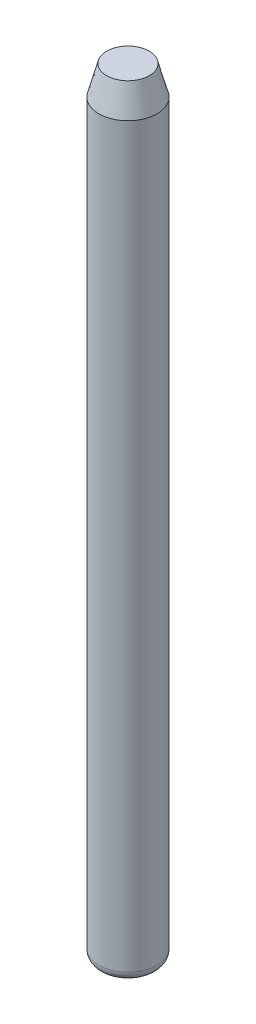
ISO-10303-21;
HEADER;
FILE_DESCRIPTION(('STEP AP214'),'2;1');
FILE_NAME('part.step','',(''),(''),'','','');
FILE_SCHEMA(('AUTOMOTIVE_DESIGN { 1 0 10303 214 1 1 1 1 }'));
ENDSEC;
DATA;
#1=APPLICATION_CONTEXT('core data for automotive mechanical design processes');
#2=APPLICATION_PROTOCOL_DEFINITION('international standard','automotive_design',2000,#1);
#3=PRODUCT_CONTEXT('',#1,'mechanical');
#4=PRODUCT('Part','Part','',(#3));
#5=PRODUCT_RELATED_PRODUCT_CATEGORY('part','',(#4));
#6=PRODUCT_DEFINITION_FORMATION('','',#4);
#7=PRODUCT_DEFINITION_CONTEXT('part definition',#1,'design');
#8=PRODUCT_DEFINITION('design','',#6,#7);
#9=PRODUCT_DEFINITION_SHAPE('','',#8);
#10=(LENGTH_UNIT() NAMED_UNIT(*) SI_UNIT(.MILLI.,.METRE.));
#11=(NAMED_UNIT(*) PLANE_ANGLE_UNIT() SI_UNIT($,.RADIAN.));
#12=(NAMED_UNIT(*) SI_UNIT($,.STERADIAN.) SOLID_ANGLE_UNIT());
#13=UNCERTAINTY_MEASURE_WITH_UNIT(LENGTH_MEASURE(1.E-05),#10,'distance_accuracy_value','');
#14=(GEOMETRIC_REPRESENTATION_CONTEXT(3) GLOBAL_UNCERTAINTY_ASSIGNED_CONTEXT((#13)) GLOBAL_UNIT_ASSIGNED_CONTEXT((#10,
#11,#12)) REPRESENTATION_CONTEXT('',''));
#15=CARTESIAN_POINT('',(0.,0.,0.));
#16=DIRECTION('',(0.,0.,1.));
#17=DIRECTION('',(1.,0.,0.));
#18=AXIS2_PLACEMENT_3D('',#15,#16,#17);
#19=CARTESIAN_POINT('',(0.,40.,0.));
#20=DIRECTION('',(0.,-1.,0.));
#21=DIRECTION('',(0.,0.,-1.));
#22=AXIS2_PLACEMENT_3D('',#19,#20,#21);
#23=CYLINDRICAL_SURFACE('',#22,1.5);
#24=CARTESIAN_POINT('',(0.,0.5,0.));
#25=DIRECTION('',(0.,1.,0.));
#26=DIRECTION('',(0.,0.,1.));
#27=AXIS2_PLACEMENT_3D('',#24,#25,#26);
#28=CIRCLE('',#27,1.5);
#29=CARTESIAN_POINT('',(0.,0.5,1.5));
#30=VERTEX_POINT('',#29);
#31=EDGE_CURVE('E38',#30,#30,#28,.T.);
#32=ORIENTED_EDGE('',*,*,#31,.T.);
#33=EDGE_LOOP('',(#32));
#34=FACE_BOUND('',#33,.T.);
#35=CARTESIAN_POINT('',(0.,38.4999999999999,0.));
#36=DIRECTION('',(0.,1.,0.));
#37=DIRECTION('',(0.,0.,1.));
#38=AXIS2_PLACEMENT_3D('',#35,#36,#37);
#39=CIRCLE('',#38,1.5);
#40=CARTESIAN_POINT('',(0.,38.4999999999999,1.5));
#41=VERTEX_POINT('',#40);
#42=EDGE_CURVE('E42',#41,#41,#39,.F.);
#43=ORIENTED_EDGE('',*,*,#42,.T.);
#44=EDGE_LOOP('',(#43));
#45=FACE_BOUND('',#44,.T.);
#46=ADVANCED_FACE('F31',(#34,#45),#23,.T.);
#47=CARTESIAN_POINT('',(0.,40.,0.));
#48=DIRECTION('',(0.,1.,0.));
#49=DIRECTION('',(0.,0.,1.));
#50=AXIS2_PLACEMENT_3D('',#47,#48,#49);
#51=PLANE('',#50);
#52=CARTESIAN_POINT('',(0.,40.,0.));
#53=DIRECTION('',(0.,1.,0.));
#54=DIRECTION('',(0.,0.,1.));
#55=AXIS2_PLACEMENT_3D('',#52,#53,#54);
#56=CIRCLE('',#55,1.0980762113533);
#57=CARTESIAN_POINT('',(0.,40.,1.0980762113533));
#58=VERTEX_POINT('',#57);
#59=EDGE_CURVE('E46',#58,#58,#56,.T.);
#60=ORIENTED_EDGE('',*,*,#59,.T.);
#61=EDGE_LOOP('',(#60));
#62=FACE_BOUND('',#61,.T.);
#63=ADVANCED_FACE('F52',(#62),#51,.T.);
#64=CARTESIAN_POINT('',(0.,0.,0.));
#65=DIRECTION('',(0.,1.,0.));
#66=DIRECTION('',(0.,0.,1.));
#67=AXIS2_PLACEMENT_3D('',#64,#65,#66);
#68=PLANE('',#67);
#69=CARTESIAN_POINT('',(0.,0.,0.));
#70=DIRECTION('',(0.,1.,0.));
#71=DIRECTION('',(0.,0.,1.));
#72=AXIS2_PLACEMENT_3D('',#69,#70,#71);
#73=CIRCLE('',#72,1.);
#74=CARTESIAN_POINT('',(0.,0.,1.));
#75=VERTEX_POINT('',#74);
#76=EDGE_CURVE('E10',#75,#75,#73,.F.);
#77=ORIENTED_EDGE('',*,*,#76,.T.);
#78=EDGE_LOOP('',(#77));
#79=FACE_BOUND('',#78,.T.);
#80=ADVANCED_FACE('F56',(#79),#68,.F.);
#81=CARTESIAN_POINT('',(0.,40.,0.));
#82=DIRECTION('',(0.,-1.,0.));
#83=DIRECTION('',(0.,0.,-1.));
#84=AXIS2_PLACEMENT_3D('',#81,#82,#83);
#85=CONICAL_SURFACE('',#84,1.0980762113533,0.261799387799146);
#86=ORIENTED_EDGE('',*,*,#42,.F.);
#87=EDGE_LOOP('',(#86));
#88=FACE_BOUND('',#87,.T.);
#89=ORIENTED_EDGE('',*,*,#59,.F.);
#90=EDGE_LOOP('',(#89));
#91=FACE_BOUND('',#90,.T.);
#92=ADVANCED_FACE('F54',(#88,#91),#85,.T.);
#93=CARTESIAN_POINT('',(0.,0.5,0.));
#94=DIRECTION('',(0.,1.,0.));
#95=DIRECTION('',(0.,0.,1.));
#96=AXIS2_PLACEMENT_3D('',#93,#94,#95);
#97=TOROIDAL_SURFACE('',#96,1.,0.5);
#98=ORIENTED_EDGE('',*,*,#76,.F.);
#99=EDGE_LOOP('',(#98));
#100=FACE_BOUND('',#99,.T.);
#101=ORIENTED_EDGE('',*,*,#31,.F.);
#102=EDGE_LOOP('',(#101));
#103=FACE_BOUND('',#102,.T.);
#104=ADVANCED_FACE('F33',(#100,#103),#97,.T.);
#105=CLOSED_SHELL('',(#46,#63,#80,#92,#104));
#106=MANIFOLD_SOLID_BREP('B2',#105);
#107=ADVANCED_BREP_SHAPE_REPRESENTATION('',(#18,#106),#14);
#108=SHAPE_DEFINITION_REPRESENTATION(#9,#107);
ENDSEC;
END-ISO-10303-21;
